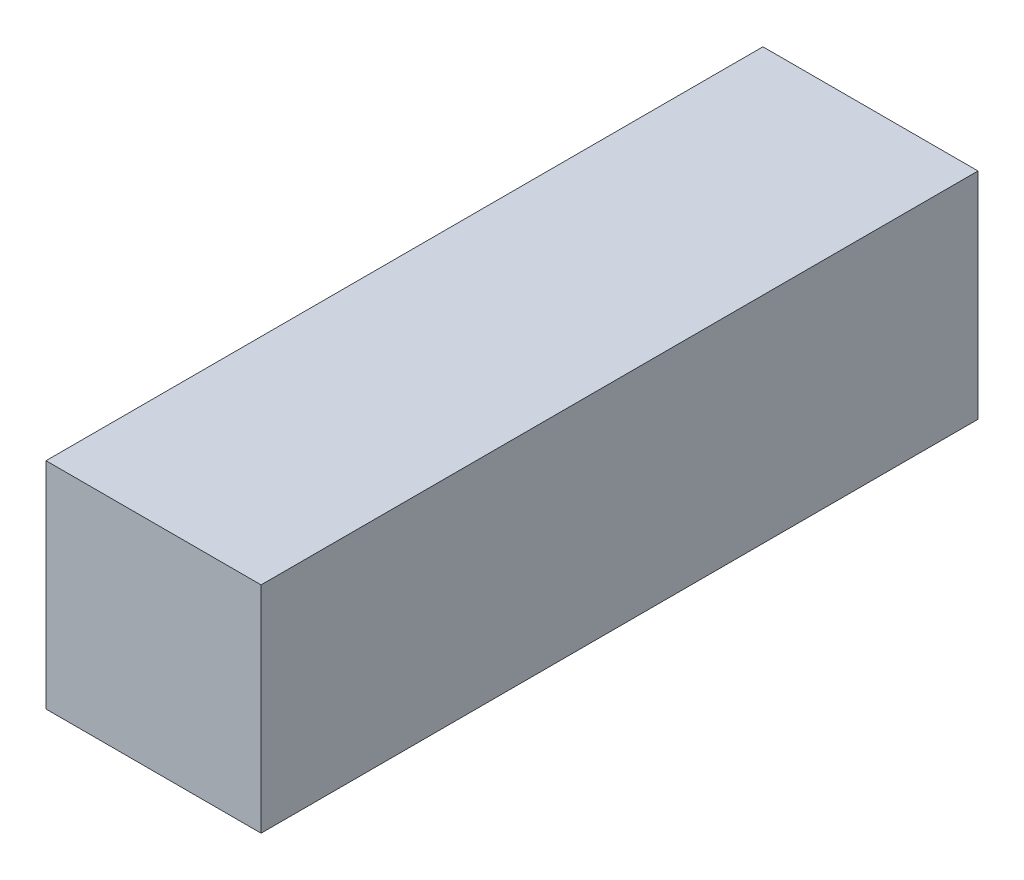
ISO-10303-21;
HEADER;
FILE_DESCRIPTION(('STEP AP214'),'2;1');
FILE_NAME('part.step','',(''),(''),'','','');
FILE_SCHEMA(('AUTOMOTIVE_DESIGN { 1 0 10303 214 1 1 1 1 }'));
ENDSEC;
DATA;
#1=APPLICATION_CONTEXT('core data for automotive mechanical design processes');
#2=APPLICATION_PROTOCOL_DEFINITION('international standard','automotive_design',2000,#1);
#3=PRODUCT_CONTEXT('',#1,'mechanical');
#4=PRODUCT('Part','Part','',(#3));
#5=PRODUCT_RELATED_PRODUCT_CATEGORY('part','',(#4));
#6=PRODUCT_DEFINITION_FORMATION('','',#4);
#7=PRODUCT_DEFINITION_CONTEXT('part definition',#1,'design');
#8=PRODUCT_DEFINITION('design','',#6,#7);
#9=PRODUCT_DEFINITION_SHAPE('','',#8);
#10=(LENGTH_UNIT() NAMED_UNIT(*) SI_UNIT(.MILLI.,.METRE.));
#11=(NAMED_UNIT(*) PLANE_ANGLE_UNIT() SI_UNIT($,.RADIAN.));
#12=(NAMED_UNIT(*) SI_UNIT($,.STERADIAN.) SOLID_ANGLE_UNIT());
#13=UNCERTAINTY_MEASURE_WITH_UNIT(LENGTH_MEASURE(1.E-05),#10,'distance_accuracy_value','');
#14=(GEOMETRIC_REPRESENTATION_CONTEXT(3) GLOBAL_UNCERTAINTY_ASSIGNED_CONTEXT((#13)) GLOBAL_UNIT_ASSIGNED_CONTEXT((#10,
#11,#12)) REPRESENTATION_CONTEXT('',''));
#15=CARTESIAN_POINT('',(0.,0.,0.));
#16=DIRECTION('',(0.,0.,1.));
#17=DIRECTION('',(1.,0.,0.));
#18=AXIS2_PLACEMENT_3D('',#15,#16,#17);
#19=CARTESIAN_POINT('',(-1.5,-1.5,10.));
#20=DIRECTION('',(1.,0.,0.));
#21=DIRECTION('',(0.,0.,-1.));
#22=AXIS2_PLACEMENT_3D('',#19,#20,#21);
#23=PLANE('',#22);
#24=DIRECTION('',(0.,-1.,0.));
#25=VECTOR('',#24,1.);
#26=CARTESIAN_POINT('',(-1.5,-1.5,0.));
#27=LINE('',#26,#25);
#28=CARTESIAN_POINT('',(-1.5,1.5,0.));
#29=VERTEX_POINT('',#28);
#30=CARTESIAN_POINT('',(-1.5,-1.5,0.));
#31=VERTEX_POINT('',#30);
#32=EDGE_CURVE('E96',#29,#31,#27,.T.);
#33=ORIENTED_EDGE('',*,*,#32,.T.);
#34=DIRECTION('',(0.,0.,-1.));
#35=VECTOR('',#34,1.);
#36=CARTESIAN_POINT('',(-1.5,-1.5,10.));
#37=LINE('',#36,#35);
#38=CARTESIAN_POINT('',(-1.5,-1.5,10.));
#39=VERTEX_POINT('',#38);
#40=EDGE_CURVE('E11',#39,#31,#37,.T.);
#41=ORIENTED_EDGE('',*,*,#40,.F.);
#42=DIRECTION('',(0.,-1.,0.));
#43=VECTOR('',#42,1.);
#44=CARTESIAN_POINT('',(-1.5,-1.5,10.));
#45=LINE('',#44,#43);
#46=CARTESIAN_POINT('',(-1.5,1.5,10.));
#47=VERTEX_POINT('',#46);
#48=EDGE_CURVE('E84',#47,#39,#45,.T.);
#49=ORIENTED_EDGE('',*,*,#48,.F.);
#50=DIRECTION('',(0.,0.,-1.));
#51=VECTOR('',#50,1.);
#52=CARTESIAN_POINT('',(-1.5,1.5,10.));
#53=LINE('',#52,#51);
#54=EDGE_CURVE('E92',#47,#29,#53,.T.);
#55=ORIENTED_EDGE('',*,*,#54,.T.);
#56=EDGE_LOOP('',(#33,#41,#49,#55));
#57=FACE_BOUND('',#56,.T.);
#58=ADVANCED_FACE('F33',(#57),#23,.F.);
#59=CARTESIAN_POINT('',(1.5,-1.5,10.));
#60=DIRECTION('',(0.,1.,0.));
#61=DIRECTION('',(-1.,0.,0.));
#62=AXIS2_PLACEMENT_3D('',#59,#60,#61);
#63=PLANE('',#62);
#64=DIRECTION('',(1.,0.,0.));
#65=VECTOR('',#64,1.);
#66=CARTESIAN_POINT('',(1.5,-1.5,0.));
#67=LINE('',#66,#65);
#68=CARTESIAN_POINT('',(1.5,-1.5,0.));
#69=VERTEX_POINT('',#68);
#70=EDGE_CURVE('E88',#31,#69,#67,.T.);
#71=ORIENTED_EDGE('',*,*,#70,.T.);
#72=DIRECTION('',(0.,0.,-1.));
#73=VECTOR('',#72,1.);
#74=CARTESIAN_POINT('',(1.5,-1.5,10.));
#75=LINE('',#74,#73);
#76=CARTESIAN_POINT('',(1.5,-1.5,10.));
#77=VERTEX_POINT('',#76);
#78=EDGE_CURVE('E41',#77,#69,#75,.T.);
#79=ORIENTED_EDGE('',*,*,#78,.F.);
#80=DIRECTION('',(1.,0.,0.));
#81=VECTOR('',#80,1.);
#82=CARTESIAN_POINT('',(1.5,-1.5,10.));
#83=LINE('',#82,#81);
#84=EDGE_CURVE('E79',#39,#77,#83,.T.);
#85=ORIENTED_EDGE('',*,*,#84,.F.);
#86=ORIENTED_EDGE('',*,*,#40,.T.);
#87=EDGE_LOOP('',(#71,#79,#85,#86));
#88=FACE_BOUND('',#87,.T.);
#89=ADVANCED_FACE('F87',(#88),#63,.F.);
#90=CARTESIAN_POINT('',(1.5,-1.5,10.));
#91=DIRECTION('',(-1.,0.,0.));
#92=DIRECTION('',(0.,0.,1.));
#93=AXIS2_PLACEMENT_3D('',#90,#91,#92);
#94=PLANE('',#93);
#95=DIRECTION('',(0.,1.,0.));
#96=VECTOR('',#95,1.);
#97=CARTESIAN_POINT('',(1.5,-1.5,0.));
#98=LINE('',#97,#96);
#99=CARTESIAN_POINT('',(1.5,1.5,0.));
#100=VERTEX_POINT('',#99);
#101=EDGE_CURVE('E66',#69,#100,#98,.T.);
#102=ORIENTED_EDGE('',*,*,#101,.T.);
#103=DIRECTION('',(0.,0.,-1.));
#104=VECTOR('',#103,1.);
#105=CARTESIAN_POINT('',(1.5,1.5,10.));
#106=LINE('',#105,#104);
#107=CARTESIAN_POINT('',(1.5,1.5,10.));
#108=VERTEX_POINT('',#107);
#109=EDGE_CURVE('E89',#108,#100,#106,.T.);
#110=ORIENTED_EDGE('',*,*,#109,.F.);
#111=DIRECTION('',(0.,1.,0.));
#112=VECTOR('',#111,1.);
#113=CARTESIAN_POINT('',(1.5,-1.5,10.));
#114=LINE('',#113,#112);
#115=EDGE_CURVE('E82',#77,#108,#114,.T.);
#116=ORIENTED_EDGE('',*,*,#115,.F.);
#117=ORIENTED_EDGE('',*,*,#78,.T.);
#118=EDGE_LOOP('',(#102,#110,#116,#117));
#119=FACE_BOUND('',#118,.T.);
#120=ADVANCED_FACE('F90',(#119),#94,.F.);
#121=CARTESIAN_POINT('',(1.5,1.5,10.));
#122=DIRECTION('',(0.,-1.,0.));
#123=DIRECTION('',(1.,0.,0.));
#124=AXIS2_PLACEMENT_3D('',#121,#122,#123);
#125=PLANE('',#124);
#126=DIRECTION('',(-1.,0.,0.));
#127=VECTOR('',#126,1.);
#128=CARTESIAN_POINT('',(1.5,1.5,0.));
#129=LINE('',#128,#127);
#130=EDGE_CURVE('E72',#100,#29,#129,.T.);
#131=ORIENTED_EDGE('',*,*,#130,.T.);
#132=ORIENTED_EDGE('',*,*,#54,.F.);
#133=DIRECTION('',(-1.,0.,0.));
#134=VECTOR('',#133,1.);
#135=CARTESIAN_POINT('',(1.5,1.5,10.));
#136=LINE('',#135,#134);
#137=EDGE_CURVE('E49',#108,#47,#136,.T.);
#138=ORIENTED_EDGE('',*,*,#137,.F.);
#139=ORIENTED_EDGE('',*,*,#109,.T.);
#140=EDGE_LOOP('',(#131,#132,#138,#139));
#141=FACE_BOUND('',#140,.T.);
#142=ADVANCED_FACE('F103',(#141),#125,.F.);
#143=CARTESIAN_POINT('',(0.,0.,10.));
#144=DIRECTION('',(0.,0.,1.));
#145=DIRECTION('',(1.,0.,0.));
#146=AXIS2_PLACEMENT_3D('',#143,#144,#145);
#147=PLANE('',#146);
#148=ORIENTED_EDGE('',*,*,#48,.T.);
#149=ORIENTED_EDGE('',*,*,#84,.T.);
#150=ORIENTED_EDGE('',*,*,#115,.T.);
#151=ORIENTED_EDGE('',*,*,#137,.T.);
#152=EDGE_LOOP('',(#148,#149,#150,#151));
#153=FACE_BOUND('',#152,.T.);
#154=ADVANCED_FACE('F80',(#153),#147,.T.);
#155=CARTESIAN_POINT('',(0.,0.,0.));
#156=DIRECTION('',(0.,0.,1.));
#157=DIRECTION('',(1.,0.,0.));
#158=AXIS2_PLACEMENT_3D('',#155,#156,#157);
#159=PLANE('',#158);
#160=ORIENTED_EDGE('',*,*,#32,.F.);
#161=ORIENTED_EDGE('',*,*,#130,.F.);
#162=ORIENTED_EDGE('',*,*,#101,.F.);
#163=ORIENTED_EDGE('',*,*,#70,.F.);
#164=EDGE_LOOP('',(#160,#161,#162,#163));
#165=FACE_BOUND('',#164,.T.);
#166=ADVANCED_FACE('F106',(#165),#159,.F.);
#167=CLOSED_SHELL('',(#58,#89,#120,#142,#154,#166));
#168=MANIFOLD_SOLID_BREP('B2',#167);
#169=ADVANCED_BREP_SHAPE_REPRESENTATION('',(#18,#168),#14);
#170=SHAPE_DEFINITION_REPRESENTATION(#9,#169);
ENDSEC;
END-ISO-10303-21;
